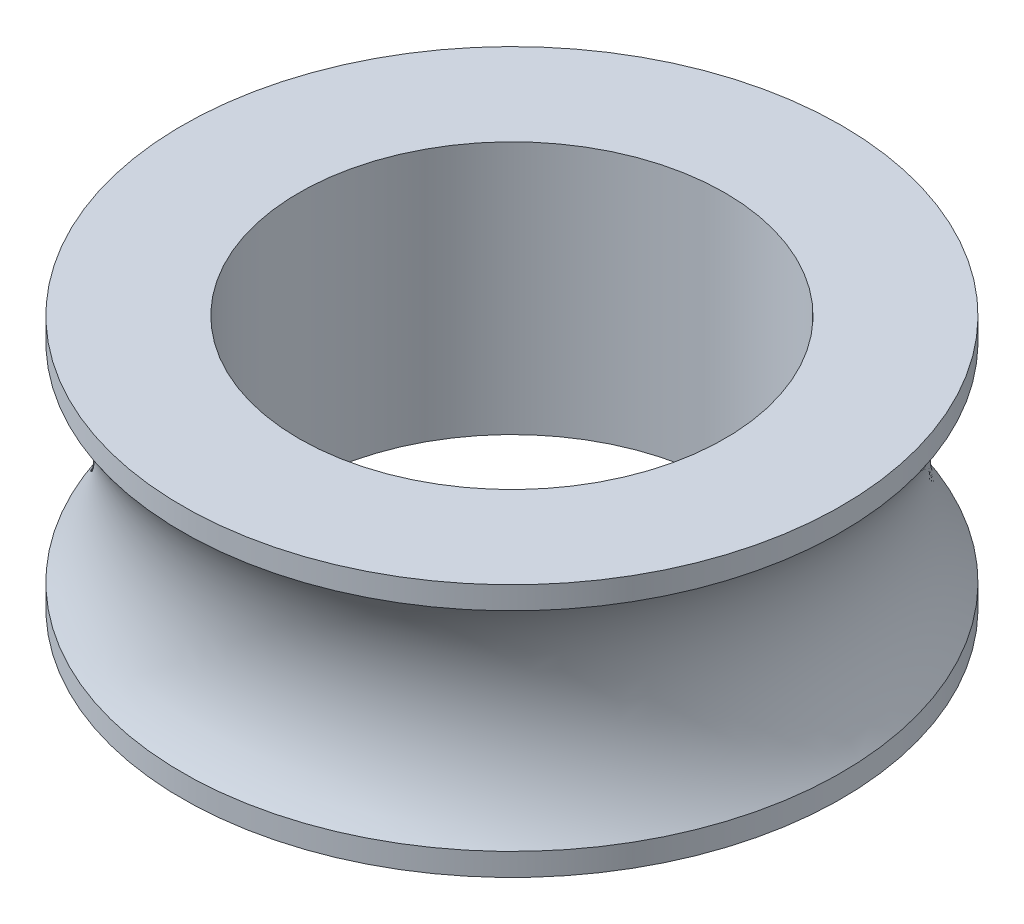
ISO-10303-21;
HEADER;
FILE_DESCRIPTION(('STEP AP214'),'2;1');
FILE_NAME('part.step','',(''),(''),'','','');
FILE_SCHEMA(('AUTOMOTIVE_DESIGN { 1 0 10303 214 1 1 1 1 }'));
ENDSEC;
DATA;
#1=APPLICATION_CONTEXT('core data for automotive mechanical design processes');
#2=APPLICATION_PROTOCOL_DEFINITION('international standard','automotive_design',2000,#1);
#3=PRODUCT_CONTEXT('',#1,'mechanical');
#4=PRODUCT('Part','Part','',(#3));
#5=PRODUCT_RELATED_PRODUCT_CATEGORY('part','',(#4));
#6=PRODUCT_DEFINITION_FORMATION('','',#4);
#7=PRODUCT_DEFINITION_CONTEXT('part definition',#1,'design');
#8=PRODUCT_DEFINITION('design','',#6,#7);
#9=PRODUCT_DEFINITION_SHAPE('','',#8);
#10=(LENGTH_UNIT() NAMED_UNIT(*) SI_UNIT(.MILLI.,.METRE.));
#11=(NAMED_UNIT(*) PLANE_ANGLE_UNIT() SI_UNIT($,.RADIAN.));
#12=(NAMED_UNIT(*) SI_UNIT($,.STERADIAN.) SOLID_ANGLE_UNIT());
#13=UNCERTAINTY_MEASURE_WITH_UNIT(LENGTH_MEASURE(1.E-05),#10,'distance_accuracy_value','');
#14=(GEOMETRIC_REPRESENTATION_CONTEXT(3) GLOBAL_UNCERTAINTY_ASSIGNED_CONTEXT((#13)) GLOBAL_UNIT_ASSIGNED_CONTEXT((#10,
#11,#12)) REPRESENTATION_CONTEXT('',''));
#15=CARTESIAN_POINT('',(0.,0.,0.));
#16=DIRECTION('',(0.,0.,1.));
#17=DIRECTION('',(1.,0.,0.));
#18=AXIS2_PLACEMENT_3D('',#15,#16,#17);
#19=CARTESIAN_POINT('',(0.,30.,0.));
#20=DIRECTION('',(0.,1.,0.));
#21=DIRECTION('',(0.,0.,1.));
#22=AXIS2_PLACEMENT_3D('',#19,#20,#21);
#23=PLANE('',#22);
#24=CARTESIAN_POINT('',(0.,30.,0.));
#25=DIRECTION('',(0.,1.,0.));
#26=DIRECTION('',(0.,0.,1.));
#27=AXIS2_PLACEMENT_3D('',#24,#25,#26);
#28=CIRCLE('',#27,25.2);
#29=CARTESIAN_POINT('',(0.,30.,25.2));
#30=VERTEX_POINT('',#29);
#31=EDGE_CURVE('E52',#30,#30,#28,.T.);
#32=ORIENTED_EDGE('',*,*,#31,.F.);
#33=EDGE_LOOP('',(#32));
#34=FACE_BOUND('',#33,.T.);
#35=CARTESIAN_POINT('',(0.,30.,0.));
#36=DIRECTION('',(0.,-1.,0.));
#37=DIRECTION('',(0.,0.,-1.));
#38=AXIS2_PLACEMENT_3D('',#35,#36,#37);
#39=CIRCLE('',#38,39.);
#40=CARTESIAN_POINT('',(0.,30.,-39.));
#41=VERTEX_POINT('',#40);
#42=EDGE_CURVE('E10',#41,#41,#39,.T.);
#43=ORIENTED_EDGE('',*,*,#42,.F.);
#44=EDGE_LOOP('',(#43));
#45=FACE_BOUND('',#44,.T.);
#46=ADVANCED_FACE('F32',(#34,#45),#23,.T.);
#47=CARTESIAN_POINT('',(0.,0.,0.));
#48=DIRECTION('',(0.,-1.,0.));
#49=DIRECTION('',(0.,0.,-1.));
#50=AXIS2_PLACEMENT_3D('',#47,#48,#49);
#51=CYLINDRICAL_SURFACE('',#50,39.);
#52=ORIENTED_EDGE('',*,*,#42,.T.);
#53=EDGE_LOOP('',(#52));
#54=FACE_BOUND('',#53,.T.);
#55=CARTESIAN_POINT('',(0.,27.3288280059379,0.));
#56=DIRECTION('',(0.,-1.,0.));
#57=DIRECTION('',(0.,0.,-1.));
#58=AXIS2_PLACEMENT_3D('',#55,#56,#57);
#59=CIRCLE('',#58,39.);
#60=CARTESIAN_POINT('',(0.,27.3288280059379,-39.));
#61=VERTEX_POINT('',#60);
#62=EDGE_CURVE('E38',#61,#61,#59,.T.);
#63=ORIENTED_EDGE('',*,*,#62,.F.);
#64=EDGE_LOOP('',(#63));
#65=FACE_BOUND('',#64,.T.);
#66=ADVANCED_FACE('F69',(#54,#65),#51,.T.);
#67=CARTESIAN_POINT('',(0.,15.,0.));
#68=DIRECTION('',(0.,-1.,0.));
#69=DIRECTION('',(0.,0.,-1.));
#70=AXIS2_PLACEMENT_3D('',#67,#68,#69);
#71=TOROIDAL_SURFACE('',#70,56.,21.);
#72=ORIENTED_EDGE('',*,*,#62,.T.);
#73=EDGE_LOOP('',(#72));
#74=FACE_BOUND('',#73,.T.);
#75=CARTESIAN_POINT('',(0.,2.67117199406207,0.));
#76=DIRECTION('',(0.,-1.,0.));
#77=DIRECTION('',(0.,0.,-1.));
#78=AXIS2_PLACEMENT_3D('',#75,#76,#77);
#79=CIRCLE('',#78,39.);
#80=CARTESIAN_POINT('',(0.,2.67117199406207,-39.));
#81=VERTEX_POINT('',#80);
#82=EDGE_CURVE('E42',#81,#81,#79,.T.);
#83=ORIENTED_EDGE('',*,*,#82,.F.);
#84=EDGE_LOOP('',(#83));
#85=FACE_BOUND('',#84,.T.);
#86=ADVANCED_FACE('F73',(#74,#85),#71,.F.);
#87=CARTESIAN_POINT('',(0.,0.,0.));
#88=DIRECTION('',(0.,-1.,0.));
#89=DIRECTION('',(0.,0.,-1.));
#90=AXIS2_PLACEMENT_3D('',#87,#88,#89);
#91=CYLINDRICAL_SURFACE('',#90,39.);
#92=ORIENTED_EDGE('',*,*,#82,.T.);
#93=EDGE_LOOP('',(#92));
#94=FACE_BOUND('',#93,.T.);
#95=CARTESIAN_POINT('',(0.,0.,0.));
#96=DIRECTION('',(0.,-1.,0.));
#97=DIRECTION('',(0.,0.,-1.));
#98=AXIS2_PLACEMENT_3D('',#95,#96,#97);
#99=CIRCLE('',#98,39.);
#100=CARTESIAN_POINT('',(0.,0.,-39.));
#101=VERTEX_POINT('',#100);
#102=EDGE_CURVE('E46',#101,#101,#99,.T.);
#103=ORIENTED_EDGE('',*,*,#102,.F.);
#104=EDGE_LOOP('',(#103));
#105=FACE_BOUND('',#104,.T.);
#106=ADVANCED_FACE('F77',(#94,#105),#91,.T.);
#107=CARTESIAN_POINT('',(0.,0.,0.));
#108=DIRECTION('',(0.,-1.,0.));
#109=DIRECTION('',(0.,0.,-1.));
#110=AXIS2_PLACEMENT_3D('',#107,#108,#109);
#111=PLANE('',#110);
#112=CARTESIAN_POINT('',(0.,0.,0.));
#113=DIRECTION('',(0.,1.,0.));
#114=DIRECTION('',(0.,0.,1.));
#115=AXIS2_PLACEMENT_3D('',#112,#113,#114);
#116=CIRCLE('',#115,25.2);
#117=CARTESIAN_POINT('',(0.,0.,25.2));
#118=VERTEX_POINT('',#117);
#119=EDGE_CURVE('E51',#118,#118,#116,.T.);
#120=ORIENTED_EDGE('',*,*,#119,.T.);
#121=EDGE_LOOP('',(#120));
#122=FACE_BOUND('',#121,.T.);
#123=ORIENTED_EDGE('',*,*,#102,.T.);
#124=EDGE_LOOP('',(#123));
#125=FACE_BOUND('',#124,.T.);
#126=ADVANCED_FACE('F58',(#122,#125),#111,.T.);
#127=CARTESIAN_POINT('',(0.,0.,0.));
#128=DIRECTION('',(0.,1.,0.));
#129=DIRECTION('',(0.,0.,1.));
#130=AXIS2_PLACEMENT_3D('',#127,#128,#129);
#131=CYLINDRICAL_SURFACE('',#130,25.2);
#132=ORIENTED_EDGE('',*,*,#119,.F.);
#133=EDGE_LOOP('',(#132));
#134=FACE_BOUND('',#133,.T.);
#135=ORIENTED_EDGE('',*,*,#31,.T.);
#136=EDGE_LOOP('',(#135));
#137=FACE_BOUND('',#136,.T.);
#138=ADVANCED_FACE('F61',(#134,#137),#131,.F.);
#139=CLOSED_SHELL('',(#46,#66,#86,#106,#126,#138));
#140=MANIFOLD_SOLID_BREP('B2',#139);
#141=ADVANCED_BREP_SHAPE_REPRESENTATION('',(#18,#140),#14);
#142=SHAPE_DEFINITION_REPRESENTATION(#9,#141);
ENDSEC;
END-ISO-10303-21;
